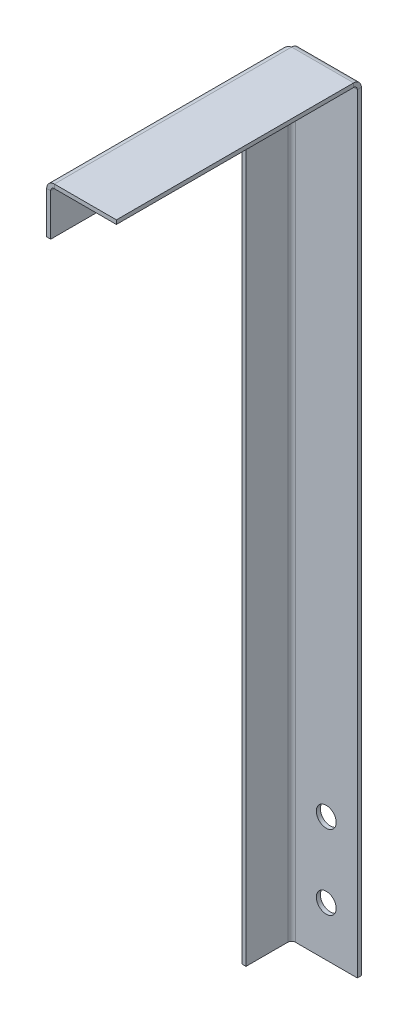
ISO-10303-21;
HEADER;
FILE_DESCRIPTION(('STEP AP214'),'2;1');
FILE_NAME('part.step','',(''),(''),'','','');
FILE_SCHEMA(('AUTOMOTIVE_DESIGN { 1 0 10303 214 1 1 1 1 }'));
ENDSEC;
DATA;
#1=APPLICATION_CONTEXT('core data for automotive mechanical design processes');
#2=APPLICATION_PROTOCOL_DEFINITION('international standard','automotive_design',2000,#1);
#3=PRODUCT_CONTEXT('',#1,'mechanical');
#4=PRODUCT('Part','Part','',(#3));
#5=PRODUCT_RELATED_PRODUCT_CATEGORY('part','',(#4));
#6=PRODUCT_DEFINITION_FORMATION('','',#4);
#7=PRODUCT_DEFINITION_CONTEXT('part definition',#1,'design');
#8=PRODUCT_DEFINITION('design','',#6,#7);
#9=PRODUCT_DEFINITION_SHAPE('','',#8);
#10=(LENGTH_UNIT() NAMED_UNIT(*) SI_UNIT(.MILLI.,.METRE.));
#11=(NAMED_UNIT(*) PLANE_ANGLE_UNIT() SI_UNIT($,.RADIAN.));
#12=(NAMED_UNIT(*) SI_UNIT($,.STERADIAN.) SOLID_ANGLE_UNIT());
#13=UNCERTAINTY_MEASURE_WITH_UNIT(LENGTH_MEASURE(1.E-05),#10,'distance_accuracy_value','');
#14=(GEOMETRIC_REPRESENTATION_CONTEXT(3) GLOBAL_UNCERTAINTY_ASSIGNED_CONTEXT((#13)) GLOBAL_UNIT_ASSIGNED_CONTEXT((#10,
#11,#12)) REPRESENTATION_CONTEXT('',''));
#15=CARTESIAN_POINT('',(0.,0.,0.));
#16=DIRECTION('',(0.,0.,1.));
#17=DIRECTION('',(1.,0.,0.));
#18=AXIS2_PLACEMENT_3D('',#15,#16,#17);
#19=CARTESIAN_POINT('',(12.5,0.,-0.81));
#20=DIRECTION('',(1.,0.,0.));
#21=DIRECTION('',(0.,0.,-1.));
#22=AXIS2_PLACEMENT_3D('',#19,#20,#21);
#23=PLANE('',#22);
#24=DIRECTION('',(0.,1.,0.));
#25=VECTOR('',#24,1.);
#26=CARTESIAN_POINT('',(12.5,0.,0.));
#27=LINE('',#26,#25);
#28=CARTESIAN_POINT('',(12.5,0.,0.));
#29=VERTEX_POINT('',#28);
#30=CARTESIAN_POINT('',(12.5,155.,0.));
#31=VERTEX_POINT('',#30);
#32=EDGE_CURVE('E140',#29,#31,#27,.T.);
#33=ORIENTED_EDGE('',*,*,#32,.F.);
#34=DIRECTION('',(0.,0.,1.));
#35=VECTOR('',#34,1.);
#36=CARTESIAN_POINT('',(12.5,0.,-0.81));
#37=LINE('',#36,#35);
#38=CARTESIAN_POINT('',(12.5,0.,-0.81));
#39=VERTEX_POINT('',#38);
#40=EDGE_CURVE('E505',#39,#29,#37,.T.);
#41=ORIENTED_EDGE('',*,*,#40,.F.);
#42=DIRECTION('',(0.,1.,0.));
#43=VECTOR('',#42,1.);
#44=CARTESIAN_POINT('',(12.5,0.,-0.81));
#45=LINE('',#44,#43);
#46=CARTESIAN_POINT('',(12.5,155.,-0.81));
#47=VERTEX_POINT('',#46);
#48=EDGE_CURVE('E115',#39,#47,#45,.T.);
#49=ORIENTED_EDGE('',*,*,#48,.T.);
#50=DIRECTION('',(0.,0.,1.));
#51=VECTOR('',#50,1.);
#52=CARTESIAN_POINT('',(12.5,155.,-0.81));
#53=LINE('',#52,#51);
#54=EDGE_CURVE('E106',#47,#31,#53,.T.);
#55=ORIENTED_EDGE('',*,*,#54,.T.);
#56=EDGE_LOOP('',(#33,#41,#49,#55));
#57=FACE_BOUND('',#56,.T.);
#58=ADVANCED_FACE('F96',(#57),#23,.T.);
#59=CARTESIAN_POINT('',(0.,0.,-0.81));
#60=DIRECTION('',(0.,-1.,0.));
#61=DIRECTION('',(0.,0.,-1.));
#62=AXIS2_PLACEMENT_3D('',#59,#60,#61);
#63=PLANE('',#62);
#64=DIRECTION('',(1.,0.,0.));
#65=VECTOR('',#64,1.);
#66=CARTESIAN_POINT('',(0.,0.,0.));
#67=LINE('',#66,#65);
#68=CARTESIAN_POINT('',(0.,0.,0.));
#69=VERTEX_POINT('',#68);
#70=EDGE_CURVE('E179',#69,#29,#67,.T.);
#71=ORIENTED_EDGE('',*,*,#70,.F.);
#72=DIRECTION('',(0.,0.,1.));
#73=VECTOR('',#72,1.);
#74=CARTESIAN_POINT('',(0.,0.,-0.81));
#75=LINE('',#74,#73);
#76=CARTESIAN_POINT('',(0.,0.,-0.810000000000006));
#77=VERTEX_POINT('',#76);
#78=EDGE_CURVE('E100',#77,#69,#75,.T.);
#79=ORIENTED_EDGE('',*,*,#78,.F.);
#80=DIRECTION('',(1.,0.,0.));
#81=VECTOR('',#80,1.);
#82=CARTESIAN_POINT('',(0.,0.,-0.81));
#83=LINE('',#82,#81);
#84=EDGE_CURVE('E496',#77,#39,#83,.T.);
#85=ORIENTED_EDGE('',*,*,#84,.T.);
#86=ORIENTED_EDGE('',*,*,#40,.T.);
#87=EDGE_LOOP('',(#71,#79,#85,#86));
#88=FACE_BOUND('',#87,.T.);
#89=ADVANCED_FACE('F98',(#88),#63,.T.);
#90=CARTESIAN_POINT('',(0.,0.,-0.81));
#91=DIRECTION('',(0.,0.,-1.));
#92=DIRECTION('',(-1.,0.,0.));
#93=AXIS2_PLACEMENT_3D('',#90,#91,#92);
#94=PLANE('',#93);
#95=CARTESIAN_POINT('',(6.25,10.,-0.81));
#96=DIRECTION('',(0.,0.,-1.));
#97=DIRECTION('',(-1.,0.,0.));
#98=AXIS2_PLACEMENT_3D('',#95,#96,#97);
#99=CIRCLE('',#98,2.);
#100=CARTESIAN_POINT('',(4.25,10.,-0.81));
#101=VERTEX_POINT('',#100);
#102=EDGE_CURVE('E562',#101,#101,#99,.F.);
#103=ORIENTED_EDGE('',*,*,#102,.T.);
#104=EDGE_LOOP('',(#103));
#105=FACE_BOUND('',#104,.T.);
#106=CARTESIAN_POINT('',(6.25,25.,-0.81));
#107=DIRECTION('',(0.,0.,-1.));
#108=DIRECTION('',(-1.,0.,0.));
#109=AXIS2_PLACEMENT_3D('',#106,#107,#108);
#110=CIRCLE('',#109,2.);
#111=CARTESIAN_POINT('',(4.25,25.,-0.81));
#112=VERTEX_POINT('',#111);
#113=EDGE_CURVE('E556',#112,#112,#110,.F.);
#114=ORIENTED_EDGE('',*,*,#113,.T.);
#115=EDGE_LOOP('',(#114));
#116=FACE_BOUND('',#115,.T.);
#117=DIRECTION('',(0.,-1.,0.));
#118=VECTOR('',#117,1.);
#119=CARTESIAN_POINT('',(0.,0.,-0.81));
#120=LINE('',#119,#118);
#121=CARTESIAN_POINT('',(0.,155.,-0.809999999999997));
#122=VERTEX_POINT('',#121);
#123=EDGE_CURVE('E145',#122,#77,#120,.T.);
#124=ORIENTED_EDGE('',*,*,#123,.F.);
#125=DIRECTION('',(-1.,0.,0.));
#126=VECTOR('',#125,1.);
#127=CARTESIAN_POINT('',(0.,155.,-0.81));
#128=LINE('',#127,#126);
#129=EDGE_CURVE('E500',#47,#122,#128,.T.);
#130=ORIENTED_EDGE('',*,*,#129,.F.);
#131=ORIENTED_EDGE('',*,*,#48,.F.);
#132=ORIENTED_EDGE('',*,*,#84,.F.);
#133=EDGE_LOOP('',(#124,#130,#131,#132));
#134=FACE_BOUND('',#133,.T.);
#135=ADVANCED_FACE('F252',(#105,#116,#134),#94,.T.);
#136=CARTESIAN_POINT('',(0.,0.,0.));
#137=DIRECTION('',(0.,0.,-1.));
#138=DIRECTION('',(-1.,0.,0.));
#139=AXIS2_PLACEMENT_3D('',#136,#137,#138);
#140=PLANE('',#139);
#141=CARTESIAN_POINT('',(6.25,10.,0.));
#142=DIRECTION('',(0.,0.,1.));
#143=DIRECTION('',(1.,0.,0.));
#144=AXIS2_PLACEMENT_3D('',#141,#142,#143);
#145=CIRCLE('',#144,2.);
#146=CARTESIAN_POINT('',(8.25,10.,0.));
#147=VERTEX_POINT('',#146);
#148=EDGE_CURVE('E560',#147,#147,#145,.T.);
#149=ORIENTED_EDGE('',*,*,#148,.F.);
#150=EDGE_LOOP('',(#149));
#151=FACE_BOUND('',#150,.T.);
#152=CARTESIAN_POINT('',(6.25,25.,0.));
#153=DIRECTION('',(0.,0.,1.));
#154=DIRECTION('',(1.,0.,0.));
#155=AXIS2_PLACEMENT_3D('',#152,#153,#154);
#156=CIRCLE('',#155,2.);
#157=CARTESIAN_POINT('',(8.25,25.,0.));
#158=VERTEX_POINT('',#157);
#159=EDGE_CURVE('E554',#158,#158,#156,.T.);
#160=ORIENTED_EDGE('',*,*,#159,.F.);
#161=EDGE_LOOP('',(#160));
#162=FACE_BOUND('',#161,.T.);
#163=DIRECTION('',(0.,-1.,0.));
#164=VECTOR('',#163,1.);
#165=CARTESIAN_POINT('',(0.,0.,0.));
#166=LINE('',#165,#164);
#167=CARTESIAN_POINT('',(0.,155.,0.));
#168=VERTEX_POINT('',#167);
#169=EDGE_CURVE('E138',#168,#69,#166,.T.);
#170=ORIENTED_EDGE('',*,*,#169,.T.);
#171=ORIENTED_EDGE('',*,*,#70,.T.);
#172=ORIENTED_EDGE('',*,*,#32,.T.);
#173=DIRECTION('',(-1.,0.,0.));
#174=VECTOR('',#173,1.);
#175=CARTESIAN_POINT('',(0.,155.,0.));
#176=LINE('',#175,#174);
#177=EDGE_CURVE('E134',#31,#168,#176,.T.);
#178=ORIENTED_EDGE('',*,*,#177,.T.);
#179=EDGE_LOOP('',(#170,#171,#172,#178));
#180=FACE_BOUND('',#179,.T.);
#181=ADVANCED_FACE('F135',(#151,#162,#180),#140,.F.);
#182=CARTESIAN_POINT('',(12.5,155.,0.736600000000006));
#183=DIRECTION('',(1.,0.,0.));
#184=DIRECTION('',(0.,0.,-1.));
#185=AXIS2_PLACEMENT_3D('',#182,#183,#184);
#186=PLANE('',#185);
#187=DIRECTION('',(0.,-1.,0.));
#188=VECTOR('',#187,1.);
#189=CARTESIAN_POINT('',(12.5,156.5466,0.736600000000001));
#190=LINE('',#189,#188);
#191=CARTESIAN_POINT('',(12.5,155.7366,0.736600000000004));
#192=VERTEX_POINT('',#191);
#193=CARTESIAN_POINT('',(12.5,156.5466,0.736600000000001));
#194=VERTEX_POINT('',#193);
#195=EDGE_CURVE('E467',#192,#194,#190,.F.);
#196=ORIENTED_EDGE('',*,*,#195,.F.);
#197=CARTESIAN_POINT('',(12.5,155.,0.736600000000006));
#198=DIRECTION('',(-1.,0.,0.));
#199=DIRECTION('',(0.,0.,1.));
#200=AXIS2_PLACEMENT_3D('',#197,#198,#199);
#201=CIRCLE('',#200,0.736600000000004);
#202=EDGE_CURVE('E166',#31,#192,#201,.F.);
#203=ORIENTED_EDGE('',*,*,#202,.F.);
#204=ORIENTED_EDGE('',*,*,#54,.F.);
#205=CARTESIAN_POINT('',(12.5,155.,0.736600000000006));
#206=DIRECTION('',(-1.,0.,0.));
#207=DIRECTION('',(0.,0.,1.));
#208=AXIS2_PLACEMENT_3D('',#205,#206,#207);
#209=CIRCLE('',#208,1.5466);
#210=EDGE_CURVE('E180',#47,#194,#209,.F.);
#211=ORIENTED_EDGE('',*,*,#210,.T.);
#212=EDGE_LOOP('',(#196,#203,#204,#211));
#213=FACE_BOUND('',#212,.T.);
#214=ADVANCED_FACE('F257',(#213),#186,.T.);
#215=CARTESIAN_POINT('',(0.,155.,0.736600000000006));
#216=DIRECTION('',(1.,0.,0.));
#217=DIRECTION('',(0.,0.,-1.));
#218=AXIS2_PLACEMENT_3D('',#215,#216,#217);
#219=PLANE('',#218);
#220=CARTESIAN_POINT('',(0.,155.,0.736600000000006));
#221=DIRECTION('',(-1.,0.,0.));
#222=DIRECTION('',(0.,0.,1.));
#223=AXIS2_PLACEMENT_3D('',#220,#221,#222);
#224=CIRCLE('',#223,0.736600000000004);
#225=CARTESIAN_POINT('',(0.,155.7366,0.736600000000005));
#226=VERTEX_POINT('',#225);
#227=EDGE_CURVE('E154',#226,#168,#224,.T.);
#228=ORIENTED_EDGE('',*,*,#227,.F.);
#229=DIRECTION('',(0.,-1.,0.));
#230=VECTOR('',#229,1.);
#231=CARTESIAN_POINT('',(0.,155.7366,0.736600000000004));
#232=LINE('',#231,#230);
#233=CARTESIAN_POINT('',(0.,156.5466,0.736600000000005));
#234=VERTEX_POINT('',#233);
#235=EDGE_CURVE('E479',#226,#234,#232,.F.);
#236=ORIENTED_EDGE('',*,*,#235,.T.);
#237=CARTESIAN_POINT('',(0.,155.,0.736600000000006));
#238=DIRECTION('',(-1.,0.,0.));
#239=DIRECTION('',(0.,0.,1.));
#240=AXIS2_PLACEMENT_3D('',#237,#238,#239);
#241=CIRCLE('',#240,1.5466);
#242=EDGE_CURVE('E157',#234,#122,#241,.T.);
#243=ORIENTED_EDGE('',*,*,#242,.T.);
#244=DIRECTION('',(0.,0.,1.));
#245=VECTOR('',#244,1.);
#246=CARTESIAN_POINT('',(0.,155.,-0.81));
#247=LINE('',#246,#245);
#248=EDGE_CURVE('E13',#122,#168,#247,.T.);
#249=ORIENTED_EDGE('',*,*,#248,.T.);
#250=EDGE_LOOP('',(#228,#236,#243,#249));
#251=FACE_BOUND('',#250,.T.);
#252=ADVANCED_FACE('F151',(#251),#219,.F.);
#253=CARTESIAN_POINT('',(0.,155.,0.736600000000006));
#254=DIRECTION('',(-1.,0.,0.));
#255=DIRECTION('',(0.,1.,0.));
#256=AXIS2_PLACEMENT_3D('',#253,#254,#255);
#257=CYLINDRICAL_SURFACE('',#256,1.5466);
#258=ORIENTED_EDGE('',*,*,#129,.T.);
#259=ORIENTED_EDGE('',*,*,#242,.F.);
#260=DIRECTION('',(-1.,0.,0.));
#261=VECTOR('',#260,1.);
#262=CARTESIAN_POINT('',(12.5,156.5466,0.736600000000001));
#263=LINE('',#262,#261);
#264=EDGE_CURVE('E484',#234,#194,#263,.F.);
#265=ORIENTED_EDGE('',*,*,#264,.T.);
#266=ORIENTED_EDGE('',*,*,#210,.F.);
#267=EDGE_LOOP('',(#258,#259,#265,#266));
#268=FACE_BOUND('',#267,.T.);
#269=ADVANCED_FACE('F264',(#268),#257,.T.);
#270=CARTESIAN_POINT('',(0.,155.,0.736600000000006));
#271=DIRECTION('',(-1.,0.,0.));
#272=DIRECTION('',(0.,1.,0.));
#273=AXIS2_PLACEMENT_3D('',#270,#271,#272);
#274=CYLINDRICAL_SURFACE('',#273,0.736600000000004);
#275=ORIENTED_EDGE('',*,*,#177,.F.);
#276=ORIENTED_EDGE('',*,*,#202,.T.);
#277=DIRECTION('',(-1.,0.,0.));
#278=VECTOR('',#277,1.);
#279=CARTESIAN_POINT('',(12.5,155.7366,0.736600000000004));
#280=LINE('',#279,#278);
#281=EDGE_CURVE('E165',#192,#226,#280,.T.);
#282=ORIENTED_EDGE('',*,*,#281,.T.);
#283=ORIENTED_EDGE('',*,*,#227,.T.);
#284=EDGE_LOOP('',(#275,#276,#282,#283));
#285=FACE_BOUND('',#284,.T.);
#286=ADVANCED_FACE('F163',(#285),#274,.F.);
#287=CARTESIAN_POINT('',(12.5,156.5466,0.));
#288=DIRECTION('',(-1.,0.,0.));
#289=DIRECTION('',(0.,0.,1.));
#290=AXIS2_PLACEMENT_3D('',#287,#288,#289);
#291=PLANE('',#290);
#292=ORIENTED_EDGE('',*,*,#195,.T.);
#293=DIRECTION('',(0.,0.,-1.));
#294=VECTOR('',#293,1.);
#295=CARTESIAN_POINT('',(12.5,156.5466,-5.34647084373176E-13));
#296=LINE('',#295,#294);
#297=CARTESIAN_POINT('',(12.5,156.5466,48.5366));
#298=VERTEX_POINT('',#297);
#299=EDGE_CURVE('E511',#298,#194,#296,.T.);
#300=ORIENTED_EDGE('',*,*,#299,.F.);
#301=DIRECTION('',(0.,-1.,0.));
#302=VECTOR('',#301,1.);
#303=CARTESIAN_POINT('',(12.5,156.5466,48.5366));
#304=LINE('',#303,#302);
#305=CARTESIAN_POINT('',(12.5,155.7366,48.5366));
#306=VERTEX_POINT('',#305);
#307=EDGE_CURVE('E483',#298,#306,#304,.T.);
#308=ORIENTED_EDGE('',*,*,#307,.T.);
#309=DIRECTION('',(0.,0.,1.));
#310=VECTOR('',#309,1.);
#311=CARTESIAN_POINT('',(12.5,155.7366,0.));
#312=LINE('',#311,#310);
#313=EDGE_CURVE('E477',#306,#192,#312,.F.);
#314=ORIENTED_EDGE('',*,*,#313,.T.);
#315=EDGE_LOOP('',(#292,#300,#308,#314));
#316=FACE_BOUND('',#315,.T.);
#317=ADVANCED_FACE('F270',(#316),#291,.F.);
#318=CARTESIAN_POINT('',(0.,156.5466,-5.34647084373176E-13));
#319=DIRECTION('',(0.,-1.,0.));
#320=DIRECTION('',(0.,0.,-1.));
#321=AXIS2_PLACEMENT_3D('',#318,#319,#320);
#322=PLANE('',#321);
#323=ORIENTED_EDGE('',*,*,#264,.F.);
#324=DIRECTION('',(0.,0.,1.));
#325=VECTOR('',#324,1.);
#326=CARTESIAN_POINT('',(0.,156.5466,-5.34647084373176E-13));
#327=LINE('',#326,#325);
#328=CARTESIAN_POINT('',(0.,156.5466,48.5366));
#329=VERTEX_POINT('',#328);
#330=EDGE_CURVE('E509',#234,#329,#327,.T.);
#331=ORIENTED_EDGE('',*,*,#330,.T.);
#332=DIRECTION('',(1.,0.,0.));
#333=VECTOR('',#332,1.);
#334=CARTESIAN_POINT('',(0.,156.5466,48.5366));
#335=LINE('',#334,#333);
#336=EDGE_CURVE('E512',#329,#298,#335,.T.);
#337=ORIENTED_EDGE('',*,*,#336,.T.);
#338=ORIENTED_EDGE('',*,*,#299,.T.);
#339=EDGE_LOOP('',(#323,#331,#337,#338));
#340=FACE_BOUND('',#339,.T.);
#341=ADVANCED_FACE('F276',(#340),#322,.F.);
#342=CARTESIAN_POINT('',(0.,155.7366,-5.31818984488713E-13));
#343=DIRECTION('',(0.,-1.,0.));
#344=DIRECTION('',(0.,0.,-1.));
#345=AXIS2_PLACEMENT_3D('',#342,#343,#344);
#346=PLANE('',#345);
#347=DIRECTION('',(0.,0.,-1.));
#348=VECTOR('',#347,1.);
#349=CARTESIAN_POINT('',(0.,155.7366,48.5366));
#350=LINE('',#349,#348);
#351=CARTESIAN_POINT('',(0.,155.7366,48.5366));
#352=VERTEX_POINT('',#351);
#353=EDGE_CURVE('E478',#226,#352,#350,.F.);
#354=ORIENTED_EDGE('',*,*,#353,.F.);
#355=ORIENTED_EDGE('',*,*,#281,.F.);
#356=ORIENTED_EDGE('',*,*,#313,.F.);
#357=DIRECTION('',(-1.,0.,0.));
#358=VECTOR('',#357,1.);
#359=CARTESIAN_POINT('',(12.5,155.7366,48.5366));
#360=LINE('',#359,#358);
#361=EDGE_CURVE('E486',#352,#306,#360,.F.);
#362=ORIENTED_EDGE('',*,*,#361,.F.);
#363=EDGE_LOOP('',(#354,#355,#356,#362));
#364=FACE_BOUND('',#363,.T.);
#365=ADVANCED_FACE('F282',(#364),#346,.T.);
#366=CARTESIAN_POINT('',(12.5,156.5466,48.5366));
#367=DIRECTION('',(0.,0.,-1.));
#368=DIRECTION('',(0.,1.,0.));
#369=AXIS2_PLACEMENT_3D('',#366,#367,#368);
#370=PLANE('',#369);
#371=ORIENTED_EDGE('',*,*,#361,.T.);
#372=ORIENTED_EDGE('',*,*,#307,.F.);
#373=ORIENTED_EDGE('',*,*,#336,.F.);
#374=DIRECTION('',(0.,-1.,0.));
#375=VECTOR('',#374,1.);
#376=CARTESIAN_POINT('',(0.,156.5466,48.5366));
#377=LINE('',#376,#375);
#378=EDGE_CURVE('E167',#329,#352,#377,.T.);
#379=ORIENTED_EDGE('',*,*,#378,.T.);
#380=EDGE_LOOP('',(#371,#372,#373,#379));
#381=FACE_BOUND('',#380,.T.);
#382=ADVANCED_FACE('F278',(#381),#370,.F.);
#383=CARTESIAN_POINT('',(0.,155.,48.5366));
#384=DIRECTION('',(0.,0.,1.));
#385=DIRECTION('',(1.,0.,0.));
#386=AXIS2_PLACEMENT_3D('',#383,#384,#385);
#387=PLANE('',#386);
#388=DIRECTION('',(1.,0.,0.));
#389=VECTOR('',#388,1.);
#390=CARTESIAN_POINT('',(-1.5466,155.,48.5366));
#391=LINE('',#390,#389);
#392=CARTESIAN_POINT('',(-0.7366,155.,48.5366));
#393=VERTEX_POINT('',#392);
#394=CARTESIAN_POINT('',(-1.5466,155.,48.5366));
#395=VERTEX_POINT('',#394);
#396=EDGE_CURVE('E523',#393,#395,#391,.F.);
#397=ORIENTED_EDGE('',*,*,#396,.F.);
#398=CARTESIAN_POINT('',(0.,155.,48.5366));
#399=DIRECTION('',(0.,0.,-1.));
#400=DIRECTION('',(-1.,0.,0.));
#401=AXIS2_PLACEMENT_3D('',#398,#399,#400);
#402=CIRCLE('',#401,0.736600000000002);
#403=EDGE_CURVE('E319',#352,#393,#402,.F.);
#404=ORIENTED_EDGE('',*,*,#403,.F.);
#405=ORIENTED_EDGE('',*,*,#378,.F.);
#406=CARTESIAN_POINT('',(0.,155.,48.5366));
#407=DIRECTION('',(0.,0.,-1.));
#408=DIRECTION('',(-1.,0.,0.));
#409=AXIS2_PLACEMENT_3D('',#406,#407,#408);
#410=CIRCLE('',#409,1.5466);
#411=EDGE_CURVE('E472',#329,#395,#410,.F.);
#412=ORIENTED_EDGE('',*,*,#411,.T.);
#413=EDGE_LOOP('',(#397,#404,#405,#412));
#414=FACE_BOUND('',#413,.T.);
#415=ADVANCED_FACE('F281',(#414),#387,.T.);
#416=CARTESIAN_POINT('',(-1.5547,155.,1.44370678118656));
#417=CARTESIAN_POINT('',(-1.55470000000003,155.203543614347,1.38477140113303));
#418=CARTESIAN_POINT('',(-1.51423532041627,155.406939435813,1.3258556509888));
#419=CARTESIAN_POINT('',(-1.35847569797443,155.782976428783,1.20800452079104));
#420=CARTESIAN_POINT('',(-1.24324203987652,155.955435785545,1.14907895569216));
#421=CARTESIAN_POINT('',(-0.95543578554506,156.243242039876,1.0312278254944));
#422=CARTESIAN_POINT('',(-0.782976428782685,156.358475697974,0.972302260395522));
#423=CARTESIAN_POINT('',(-0.406939435813399,156.514235320416,0.854451130197764));
#424=CARTESIAN_POINT('',(-0.203543614347026,156.5547,0.795535380053542));
#425=CARTESIAN_POINT('',(0.,156.5547,0.736600000000005));
#426=CARTESIAN_POINT('',(-1.5466,155.,1.44370678118656));
#427=CARTESIAN_POINT('',(-1.54660000000003,155.202483116895,1.38477142172481));
#428=CARTESIAN_POINT('',(-1.50634614173526,155.40481927795,1.3258556509888));
#429=CARTESIAN_POINT('',(-1.35139802822876,155.778897115042,1.20800452079104));
#430=CARTESIAN_POINT('',(-1.23676473845309,155.950457957113,1.14907895569216));
#431=CARTESIAN_POINT('',(-0.950457957113263,156.236764738453,1.0312278254944));
#432=CARTESIAN_POINT('',(-0.778897115041681,156.351398028229,0.972302260395522));
#433=CARTESIAN_POINT('',(-0.404819277950089,156.506346141735,0.854451130197764));
#434=CARTESIAN_POINT('',(-0.202483116895243,156.5466,0.795535359461768));
#435=CARTESIAN_POINT('',(0.,156.5466,0.736600000000005));
#436=CARTESIAN_POINT('',(-0.736600000000003,155.,1.44370678118656));
#437=CARTESIAN_POINT('',(-0.736600000000014,155.096433371717,1.38477348090225));
#438=CARTESIAN_POINT('',(-0.717428273633904,155.192803491619,1.3258556509888));
#439=CARTESIAN_POINT('',(-0.643631053661778,155.370965740941,1.20800452079104));
#440=CARTESIAN_POINT('',(-0.589034596110533,155.452675113934,1.14907895569216));
#441=CARTESIAN_POINT('',(-0.452675113933553,155.589034596111,1.0312278254944));
#442=CARTESIAN_POINT('',(-0.370965740941231,155.643631053662,0.972302260395522));
#443=CARTESIAN_POINT('',(-0.19280349161906,155.717428273634,0.854451130197764));
#444=CARTESIAN_POINT('',(-0.0964333717169542,155.7366,0.795533300284292));
#445=CARTESIAN_POINT('',(0.,155.7366,0.736600000000005));
#446=CARTESIAN_POINT('',(-0.728419000000003,155.,1.44370678118656));
#447=CARTESIAN_POINT('',(-0.728419000000014,155.095362269291,1.38477350169994));
#448=CARTESIAN_POINT('',(-0.70946020316608,155.190662132177,1.3258556509888));
#449=CARTESIAN_POINT('',(-0.636482607218652,155.366845634063,1.20800452079104));
#450=CARTESIAN_POINT('',(-0.582492521672873,155.447647507217,1.14907895569216));
#451=CARTESIAN_POINT('',(-0.447647507217438,155.582492521673,1.0312278254944));
#452=CARTESIAN_POINT('',(-0.366845634062816,155.636482607219,0.972302260395522));
#453=CARTESIAN_POINT('',(-0.190662132177117,155.709460203166,0.854451130197764));
#454=CARTESIAN_POINT('',(-0.0953622692906535,155.728419,0.795533279486599));
#455=CARTESIAN_POINT('',(0.,155.728419,0.736600000000005));
#456=B_SPLINE_SURFACE_WITH_KNOTS('',1,3,((#416,#417,#418,#419,#420,#421,#422,#423,#424,#425),
(#426,#427,#428,#429,#430,#431,#432,#433,#434,#435),(#436,#437,#438,#439,#440,#441,#442,#443,
#444,#445),(#446,#447,#448,#449,#450,#451,#452,#453,#454,#455)),.UNSPECIFIED.,.F.,.F.,.F.,(2,1,
1,2),(4,2,2,2,4),(-0.01,0.,1.,1.0101),(0.,0.25,0.5,0.75,1.),.UNSPECIFIED.);
#457=CARTESIAN_POINT('',(-0.736600000000003,155.,1.44370678118656));
#458=CARTESIAN_POINT('',(-0.736600650815132,155.02683709898,1.42730387734434));
#459=CARTESIAN_POINT('',(-0.735131906011697,155.053658407147,1.41091256013043));
#460=CARTESIAN_POINT('',(-0.729283632859912,155.106982090652,1.37813068605329));
#461=CARTESIAN_POINT('',(-0.724904112139275,155.133484466824,1.36174012918818));
#462=CARTESIAN_POINT('',(-0.707475007773645,155.211931055611,1.31263058704175));
#463=CARTESIAN_POINT('',(-0.690134514092446,155.262973049785,1.27987924509061));
#464=CARTESIAN_POINT('',(-0.646924095972169,155.355586017775,1.21742214405926));
#465=CARTESIAN_POINT('',(-0.621983707101651,155.39759629148,1.18771290560021));
#466=CARTESIAN_POINT('',(-0.564339918878841,155.475876375384,1.12830251911178));
#467=CARTESIAN_POINT('',(-0.531641403416091,155.512149773211,1.09860137771426));
#468=CARTESIAN_POINT('',(-0.459756033776209,155.577551727805,1.03920791503063));
#469=CARTESIAN_POINT('',(-0.420569908991761,155.606681086854,1.00951559312849));
#470=CARTESIAN_POINT('',(-0.337216250616945,155.656678868693,0.950114378058107));
#471=CARTESIAN_POINT('',(-0.293047099221366,155.677544598613,0.920405482642109));
#472=CARTESIAN_POINT('',(-0.207663411402385,155.707969999017,0.865009732940531));
#473=CARTESIAN_POINT('',(-0.166853496100309,155.718674766999,0.839320684350566));
#474=CARTESIAN_POINT('',(-0.0840347371591856,155.733004715695,0.787956735105949));
#475=CARTESIAN_POINT('',(-0.0420265862914266,155.736633906293,0.762281834686468));
#476=CARTESIAN_POINT('',(0.,155.7366,0.736600000000005));
#477=B_SPLINE_CURVE_WITH_KNOTS('',3,(#457,#458,#459,#460,#461,#462,#463,#464,#465,#466,#467,
#468,#469,#470,#471,#472,#473,#474,#475,#476),.UNSPECIFIED.,.F.,.F.,(4,2,2,2,2,2,2,2,2,4),(0.,
0.0942858505156115,0.188571453955301,0.376598060041108,0.547357381731374,0.718009491041878,
0.8886424271914,1.05933092186686,1.2070048166953,1.35459499714926),.UNSPECIFIED.);
#478=CARTESIAN_POINT('',(-0.736600000000003,155.,1.44370678118656));
#479=VERTEX_POINT('',#478);
#480=EDGE_CURVE('E313',#479,#226,#477,.T.);
#481=DIRECTION('',(-1.,0.,0.));
#482=VECTOR('',#481,1.);
#483=CARTESIAN_POINT('',(-0.7366,155.,1.44370678118656));
#484=LINE('',#483,#482);
#485=CARTESIAN_POINT('',(-1.5466,155.,1.44370678118656));
#486=VERTEX_POINT('',#485);
#487=EDGE_CURVE('E320',#486,#479,#484,.F.);
#488=CARTESIAN_POINT('',(-1.5466,155.,1.44370678118656));
#489=CARTESIAN_POINT('',(-1.54660001518247,155.045325633854,1.43051315392023));
#490=CARTESIAN_POINT('',(-1.54460619523529,155.090629729696,1.4173265263798));
#491=CARTESIAN_POINT('',(-1.53665413907272,155.180886369307,1.39095452784367));
#492=CARTESIAN_POINT('',(-1.53069610991545,155.225838931312,1.37776915681832));
#493=CARTESIAN_POINT('',(-1.50693686998447,155.359564069098,1.33823800584838));
#494=CARTESIAN_POINT('',(-1.48325032932352,155.447358192905,1.31187301956955));
#495=CARTESIAN_POINT('',(-1.42089069240408,155.617466292517,1.25913743772194));
#496=CARTESIAN_POINT('',(-1.38220776896099,155.699776633246,1.23276684983128));
#497=CARTESIAN_POINT('',(-1.291053056864,155.856360507244,1.18003130769415));
#498=CARTESIAN_POINT('',(-1.23858446923998,155.930635900582,1.15366635356));
#499=CARTESIAN_POINT('',(-1.12147686554034,156.068863220653,1.10093521481356));
#500=CARTESIAN_POINT('',(-1.05683850517409,156.13281570324,1.07456903034405));
#501=CARTESIAN_POINT('',(-0.917349509950495,156.248458728673,1.02183039950967));
#502=CARTESIAN_POINT('',(-0.842495400187767,156.300145082716,0.995457954075425));
#503=CARTESIAN_POINT('',(-0.684887676067448,156.389648066131,0.942703607805266));
#504=CARTESIAN_POINT('',(-0.602131149243525,156.42745955681,0.916321707081107));
#505=CARTESIAN_POINT('',(-0.431321914570935,156.487992559248,0.863574536452941));
#506=CARTESIAN_POINT('',(-0.343275035883754,156.510730359053,0.837209279453678));
#507=CARTESIAN_POINT('',(-0.212011589838877,156.532593682912,0.798477792974017));
#508=CARTESIAN_POINT('',(-0.169741537098491,156.537846919397,0.786090663240772));
#509=CARTESIAN_POINT('',(-0.0849873234932795,156.544846620693,0.761337814365416));
#510=CARTESIAN_POINT('',(-0.042503672649507,156.546599262809,0.748972096049318));
#511=CARTESIAN_POINT('',(0.,156.5466,0.736600000000005));
#512=B_SPLINE_CURVE_WITH_KNOTS('',3,(#488,#489,#490,#491,#492,#493,#494,#495,#496,#497,#498,
#499,#500,#501,#502,#503,#504,#505,#506,#507,#508,#509,#510,#511),.UNSPECIFIED.,.F.,.F.,(4,2,2,
2,2,2,2,2,2,2,2,4),(0.,0.141533472521888,0.283059553063728,0.565636935266527,0.848399805327377,
1.13109707581384,1.41377911888177,1.69655755752738,1.97944062048793,2.2620175105342,
2.39497904894072,2.52770574941885),.UNSPECIFIED.);
#513=EDGE_CURVE('E306',#486,#234,#512,.T.);
#514=ORIENTED_EDGE('',*,*,#480,.F.);
#515=ORIENTED_EDGE('',*,*,#487,.F.);
#516=ORIENTED_EDGE('',*,*,#513,.T.);
#517=ORIENTED_EDGE('',*,*,#235,.F.);
#518=EDGE_LOOP('',(#514,#515,#516,#517));
#519=FACE_BOUND('',#518,.T.);
#520=ADVANCED_FACE('F290',(#519),#456,.F.);
#521=CARTESIAN_POINT('',(0.,155.,0.736600000000004));
#522=DIRECTION('',(0.,0.,-1.));
#523=DIRECTION('',(-1.,0.,0.));
#524=AXIS2_PLACEMENT_3D('',#521,#522,#523);
#525=CYLINDRICAL_SURFACE('',#524,1.5466);
#526=ORIENTED_EDGE('',*,*,#330,.F.);
#527=ORIENTED_EDGE('',*,*,#513,.F.);
#528=DIRECTION('',(0.,0.,-1.));
#529=VECTOR('',#528,1.);
#530=CARTESIAN_POINT('',(-1.5466,155.,48.5366));
#531=LINE('',#530,#529);
#532=EDGE_CURVE('E532',#486,#395,#531,.F.);
#533=ORIENTED_EDGE('',*,*,#532,.T.);
#534=ORIENTED_EDGE('',*,*,#411,.F.);
#535=EDGE_LOOP('',(#526,#527,#533,#534));
#536=FACE_BOUND('',#535,.T.);
#537=ADVANCED_FACE('F296',(#536),#525,.T.);
#538=CARTESIAN_POINT('',(0.,155.,0.736600000000004));
#539=DIRECTION('',(0.,0.,-1.));
#540=DIRECTION('',(-1.,0.,0.));
#541=AXIS2_PLACEMENT_3D('',#538,#539,#540);
#542=CYLINDRICAL_SURFACE('',#541,0.736600000000002);
#543=ORIENTED_EDGE('',*,*,#353,.T.);
#544=ORIENTED_EDGE('',*,*,#403,.T.);
#545=DIRECTION('',(0.,0.,-1.));
#546=VECTOR('',#545,1.);
#547=CARTESIAN_POINT('',(-0.7366,155.,48.5366));
#548=LINE('',#547,#546);
#549=EDGE_CURVE('E529',#393,#479,#548,.T.);
#550=ORIENTED_EDGE('',*,*,#549,.T.);
#551=ORIENTED_EDGE('',*,*,#480,.T.);
#552=EDGE_LOOP('',(#543,#544,#550,#551));
#553=FACE_BOUND('',#552,.T.);
#554=ADVANCED_FACE('F322',(#553),#542,.F.);
#555=CARTESIAN_POINT('',(-1.54660000000054,0.,0.));
#556=DIRECTION('',(1.,0.,0.));
#557=DIRECTION('',(0.,1.,0.));
#558=AXIS2_PLACEMENT_3D('',#555,#556,#557);
#559=PLANE('',#558);
#560=DIRECTION('',(0.,0.707106781186544,-0.707106781186551));
#561=VECTOR('',#560,1.);
#562=CARTESIAN_POINT('',(-1.54660000000012,121.1632103822,35.2804963989872));
#563=LINE('',#562,#561);
#564=CARTESIAN_POINT('',(-1.54660000000003,146.5466,9.89710678118662));
#565=VERTEX_POINT('',#564);
#566=EDGE_CURVE('E203',#565,#486,#563,.T.);
#567=ORIENTED_EDGE('',*,*,#566,.F.);
#568=DIRECTION('',(0.,0.,1.));
#569=VECTOR('',#568,1.);
#570=CARTESIAN_POINT('',(-1.54660000000003,146.5466,-5.10563000524685E-13));
#571=LINE('',#570,#569);
#572=CARTESIAN_POINT('',(-1.54660000000003,146.5466,48.5366));
#573=VERTEX_POINT('',#572);
#574=EDGE_CURVE('E539',#565,#573,#571,.T.);
#575=ORIENTED_EDGE('',*,*,#574,.T.);
#576=DIRECTION('',(0.,1.,0.));
#577=VECTOR('',#576,1.);
#578=CARTESIAN_POINT('',(-1.54660000000054,1.86065487183914E-13,48.5366000000006));
#579=LINE('',#578,#577);
#580=EDGE_CURVE('E541',#573,#395,#579,.T.);
#581=ORIENTED_EDGE('',*,*,#580,.T.);
#582=ORIENTED_EDGE('',*,*,#532,.F.);
#583=EDGE_LOOP('',(#567,#575,#581,#582));
#584=FACE_BOUND('',#583,.T.);
#585=ADVANCED_FACE('F325',(#584),#559,.F.);
#586=CARTESIAN_POINT('',(-0.736600000000541,0.,0.));
#587=DIRECTION('',(1.,0.,0.));
#588=DIRECTION('',(0.,1.,0.));
#589=AXIS2_PLACEMENT_3D('',#586,#587,#588);
#590=PLANE('',#589);
#591=DIRECTION('',(0.,0.,-1.));
#592=VECTOR('',#591,1.);
#593=CARTESIAN_POINT('',(-0.736600000000029,146.5466,48.5366));
#594=LINE('',#593,#592);
#595=CARTESIAN_POINT('',(-0.736600000000029,146.5466,9.89710678118662));
#596=VERTEX_POINT('',#595);
#597=CARTESIAN_POINT('',(-0.736600000000029,146.5466,48.5366));
#598=VERTEX_POINT('',#597);
#599=EDGE_CURVE('E534',#596,#598,#594,.F.);
#600=ORIENTED_EDGE('',*,*,#599,.F.);
#601=DIRECTION('',(0.,0.707106781186544,-0.707106781186551));
#602=VECTOR('',#601,1.);
#603=CARTESIAN_POINT('',(-0.736600000000268,78.2218533905941,78.2218533905933));
#604=LINE('',#603,#602);
#605=EDGE_CURVE('E530',#596,#479,#604,.T.);
#606=ORIENTED_EDGE('',*,*,#605,.T.);
#607=ORIENTED_EDGE('',*,*,#549,.F.);
#608=DIRECTION('',(0.,-1.,0.));
#609=VECTOR('',#608,1.);
#610=CARTESIAN_POINT('',(-0.736599999999997,155.7366,48.5366));
#611=LINE('',#610,#609);
#612=EDGE_CURVE('E536',#598,#393,#611,.F.);
#613=ORIENTED_EDGE('',*,*,#612,.F.);
#614=EDGE_LOOP('',(#600,#606,#607,#613));
#615=FACE_BOUND('',#614,.T.);
#616=ADVANCED_FACE('F335',(#615),#590,.T.);
#617=CARTESIAN_POINT('',(-1.54660000000003,146.5466,48.5366));
#618=DIRECTION('',(0.,1.,0.));
#619=DIRECTION('',(-1.,0.,0.));
#620=AXIS2_PLACEMENT_3D('',#617,#618,#619);
#621=PLANE('',#620);
#622=DIRECTION('',(-1.,0.,0.));
#623=VECTOR('',#622,1.);
#624=CARTESIAN_POINT('',(-1.54660000000003,146.5466,9.89710678118662));
#625=LINE('',#624,#623);
#626=EDGE_CURVE('E550',#596,#565,#625,.T.);
#627=ORIENTED_EDGE('',*,*,#626,.F.);
#628=ORIENTED_EDGE('',*,*,#599,.T.);
#629=DIRECTION('',(1.,0.,0.));
#630=VECTOR('',#629,1.);
#631=CARTESIAN_POINT('',(-1.54660000000003,146.5466,48.5366));
#632=LINE('',#631,#630);
#633=EDGE_CURVE('E544',#573,#598,#632,.T.);
#634=ORIENTED_EDGE('',*,*,#633,.F.);
#635=ORIENTED_EDGE('',*,*,#574,.F.);
#636=EDGE_LOOP('',(#627,#628,#634,#635));
#637=FACE_BOUND('',#636,.T.);
#638=ADVANCED_FACE('F331',(#637),#621,.F.);
#639=CARTESIAN_POINT('',(-1.5466,155.7366,48.5366));
#640=DIRECTION('',(0.,0.,-1.));
#641=DIRECTION('',(0.,1.,0.));
#642=AXIS2_PLACEMENT_3D('',#639,#640,#641);
#643=PLANE('',#642);
#644=ORIENTED_EDGE('',*,*,#396,.T.);
#645=ORIENTED_EDGE('',*,*,#580,.F.);
#646=ORIENTED_EDGE('',*,*,#633,.T.);
#647=ORIENTED_EDGE('',*,*,#612,.T.);
#648=EDGE_LOOP('',(#644,#645,#646,#647));
#649=FACE_BOUND('',#648,.T.);
#650=ADVANCED_FACE('F334',(#649),#643,.F.);
#651=CARTESIAN_POINT('',(-1.54660000000012,121.1632103822,35.2804963989872));
#652=DIRECTION('',(0.,-0.707106781186551,-0.707106781186544));
#653=DIRECTION('',(0.,0.707106781186544,-0.707106781186551));
#654=AXIS2_PLACEMENT_3D('',#651,#652,#653);
#655=PLANE('',#654);
#656=ORIENTED_EDGE('',*,*,#605,.F.);
#657=ORIENTED_EDGE('',*,*,#626,.T.);
#658=ORIENTED_EDGE('',*,*,#566,.T.);
#659=ORIENTED_EDGE('',*,*,#487,.T.);
#660=EDGE_LOOP('',(#656,#657,#658,#659));
#661=FACE_BOUND('',#660,.T.);
#662=ADVANCED_FACE('F339',(#661),#655,.T.);
#663=CARTESIAN_POINT('',(0.,155.,-0.818100000000006));
#664=CARTESIAN_POINT('',(-0.203543614346979,154.941064619946,-0.818100000000004));
#665=CARTESIAN_POINT('',(-0.406939435813378,154.882148869802,-0.777635320416233));
#666=CARTESIAN_POINT('',(-0.78297642878264,154.764297739604,-0.621875697974366));
#667=CARTESIAN_POINT('',(-0.955435785545002,154.705372174506,-0.506642039876452));
#668=CARTESIAN_POINT('',(-1.24324203987645,154.587521044308,-0.218835785545002));
#669=CARTESIAN_POINT('',(-1.35847569797436,154.528595479209,-0.0463764287826398));
#670=CARTESIAN_POINT('',(-1.51423532041623,154.410744349011,0.329660564186623));
#671=CARTESIAN_POINT('',(-1.5547,154.351828598867,0.533056385652977));
#672=CARTESIAN_POINT('',(-1.5547,154.292893218813,0.736599999999995));
#673=CARTESIAN_POINT('',(0.,155.,-0.810000000000006));
#674=CARTESIAN_POINT('',(-0.202483116895197,154.941064640538,-0.810000000000004));
#675=CARTESIAN_POINT('',(-0.404819277950067,154.882148869802,-0.76974614173522));
#676=CARTESIAN_POINT('',(-0.778897115041636,154.764297739604,-0.614798028228697));
#677=CARTESIAN_POINT('',(-0.950457957113205,154.705372174506,-0.500164738453027));
#678=CARTESIAN_POINT('',(-1.23676473845303,154.587521044308,-0.213857957113205));
#679=CARTESIAN_POINT('',(-1.35139802822869,154.528595479209,-0.0422971150416355));
#680=CARTESIAN_POINT('',(-1.50634614173522,154.410744349011,0.331780722049934));
#681=CARTESIAN_POINT('',(-1.5466,154.351828578275,0.53411688310476));
#682=CARTESIAN_POINT('',(-1.5466,154.292893218813,0.736599999999995));
#683=CARTESIAN_POINT('',(0.,155.,0.));
#684=CARTESIAN_POINT('',(-0.0964333717169591,154.941066699716,0.));
#685=CARTESIAN_POINT('',(-0.192803491619046,154.882148869802,0.0191717263661145));
#686=CARTESIAN_POINT('',(-0.370965740941204,154.764297739604,0.0929689463382503));
#687=CARTESIAN_POINT('',(-0.452675113933522,154.705372174506,0.147565403889497));
#688=CARTESIAN_POINT('',(-0.589034596110499,154.587521044308,0.283924886066475));
#689=CARTESIAN_POINT('',(-0.643631053661746,154.528595479209,0.365634259058793));
#690=CARTESIAN_POINT('',(-0.717428273633881,154.410744349011,0.543796508380952));
#691=CARTESIAN_POINT('',(-0.7366,154.351826519098,0.640166628283038));
#692=CARTESIAN_POINT('',(-0.7366,154.292893218813,0.736599999999997));
#693=CARTESIAN_POINT('',(0.,155.,0.00818099999999436));
#694=CARTESIAN_POINT('',(-0.0953622692906589,154.941066720513,0.00818099999999509));
#695=CARTESIAN_POINT('',(-0.190662132177103,154.882148869802,0.027139796833938));
#696=CARTESIAN_POINT('',(-0.36684563406279,154.764297739604,0.100117392781376));
#697=CARTESIAN_POINT('',(-0.447647507217407,154.705372174506,0.154107478327157));
#698=CARTESIAN_POINT('',(-0.582492521672839,154.587521044308,0.28895249278259));
#699=CARTESIAN_POINT('',(-0.636482607218619,154.528595479209,0.369754365937207));
#700=CARTESIAN_POINT('',(-0.709460203166057,154.410744349011,0.545937867822895));
#701=CARTESIAN_POINT('',(-0.728419,154.3518264983,0.641237730709339));
#702=CARTESIAN_POINT('',(-0.728419,154.292893218813,0.736599999999997));
#703=B_SPLINE_SURFACE_WITH_KNOTS('',1,3,((#663,#664,#665,#666,#667,#668,#669,#670,#671,#672),
(#673,#674,#675,#676,#677,#678,#679,#680,#681,#682),(#683,#684,#685,#686,#687,#688,#689,#690,
#691,#692),(#693,#694,#695,#696,#697,#698,#699,#700,#701,#702)),.UNSPECIFIED.,.F.,.F.,.F.,(2,1,
1,2),(4,2,2,2,4),(-0.01,0.,1.,1.0101),(0.,0.25,0.5,0.75,1.),.UNSPECIFIED.);
#704=DIRECTION('',(1.,0.,0.));
#705=VECTOR('',#704,1.);
#706=CARTESIAN_POINT('',(-0.7366,154.292893218813,0.736599999999997));
#707=LINE('',#706,#705);
#708=CARTESIAN_POINT('',(-1.5466,154.292893218813,0.736599999999995));
#709=VERTEX_POINT('',#708);
#710=CARTESIAN_POINT('',(-0.7366,154.292893218813,0.736599999999997));
#711=VERTEX_POINT('',#710);
#712=EDGE_CURVE('E185',#709,#711,#707,.T.);
#713=CARTESIAN_POINT('',(0.,155.,0.));
#714=CARTESIAN_POINT('',(-0.0268370989802788,154.983597096158,-6.50815130533243E-07));
#715=CARTESIAN_POINT('',(-0.0536584071473606,154.967205778944,0.00146809398830754));
#716=CARTESIAN_POINT('',(-0.106982090651545,154.934423904867,0.00731636714009691));
#717=CARTESIAN_POINT('',(-0.133484466824227,154.918033348002,0.0116958878607341));
#718=CARTESIAN_POINT('',(-0.211931055610941,154.868923805855,0.0291249922263718));
#719=CARTESIAN_POINT('',(-0.262973049785376,154.836172463904,0.0464654859075808));
#720=CARTESIAN_POINT('',(-0.355586017774943,154.773715362873,0.089675904027877));
#721=CARTESIAN_POINT('',(-0.39759629148032,154.744006124414,0.114616292898406));
#722=CARTESIAN_POINT('',(-0.475876375384296,154.684595737925,0.172260081121222));
#723=CARTESIAN_POINT('',(-0.512149773210601,154.654894596528,0.204958596583967));
#724=CARTESIAN_POINT('',(-0.577551727804723,154.595501133844,0.276843966223847));
#725=CARTESIAN_POINT('',(-0.606681086854152,154.565808811942,0.316030091008298));
#726=CARTESIAN_POINT('',(-0.656678868693253,154.506407596871,0.399383749383123));
#727=CARTESIAN_POINT('',(-0.677544598612475,154.476698701455,0.443552900778708));
#728=CARTESIAN_POINT('',(-0.707969999017304,154.421302951754,0.528936588597682));
#729=CARTESIAN_POINT('',(-0.718674766999145,154.395613903164,0.569746503899746));
#730=CARTESIAN_POINT('',(-0.733004715694662,154.344249953919,0.652565262840841));
#731=CARTESIAN_POINT('',(-0.736633906292474,154.3185750535,0.694573413708583));
#732=CARTESIAN_POINT('',(-0.7366,154.292893218813,0.736599999999997));
#733=B_SPLINE_CURVE_WITH_KNOTS('',3,(#713,#714,#715,#716,#717,#718,#719,#720,#721,#722,#723,
#724,#725,#726,#727,#728,#729,#730,#731,#732),.UNSPECIFIED.,.F.,.F.,(4,2,2,2,2,2,2,2,2,4),(0.,
0.0942858505156046,0.188571453955277,0.376598060041105,0.547357381731401,0.71800949104192,
0.888642427191432,1.05933092186688,1.20700481669527,1.35459499714919),.UNSPECIFIED.);
#734=EDGE_CURVE('E175',#168,#711,#733,.T.);
#735=CARTESIAN_POINT('',(0.,155.,-0.810000000000006));
#736=CARTESIAN_POINT('',(-0.0453256338536851,154.986806372734,-0.810000015182461));
#737=CARTESIAN_POINT('',(-0.0906297296964364,154.973619745193,-0.808006195235277));
#738=CARTESIAN_POINT('',(-0.180886369307038,154.947247746657,-0.800054139072697));
#739=CARTESIAN_POINT('',(-0.225838931312098,154.934062375632,-0.794096109915429));
#740=CARTESIAN_POINT('',(-0.359564069098027,154.894531224662,-0.77033686998443));
#741=CARTESIAN_POINT('',(-0.447358192905265,154.868166238383,-0.746650329323468));
#742=CARTESIAN_POINT('',(-0.617466292517522,154.815430656535,-0.684290692404006));
#743=CARTESIAN_POINT('',(-0.69977663324585,154.789060068645,-0.645607768960904));
#744=CARTESIAN_POINT('',(-0.856360507243822,154.736324526508,-0.554453056863889));
#745=CARTESIAN_POINT('',(-0.930635900582599,154.709959572373,-0.501984469239858));
#746=CARTESIAN_POINT('',(-1.068863220653,154.657228433627,-0.384876865540206));
#747=CARTESIAN_POINT('',(-1.1328157032401,154.630862249157,-0.32023850517394));
#748=CARTESIAN_POINT('',(-1.24845872867253,154.578123618323,-0.180749509950337));
#749=CARTESIAN_POINT('',(-1.30014508271638,154.551751172889,-0.105895400187606));
#750=CARTESIAN_POINT('',(-1.38964806613116,154.498996826619,0.0517123239327148));
#751=CARTESIAN_POINT('',(-1.42745955681043,154.472614925895,0.134468850756639));
#752=CARTESIAN_POINT('',(-1.48799255924768,154.419867755266,0.305278085429234));
#753=CARTESIAN_POINT('',(-1.51073035905341,154.393502498267,0.393324964116418));
#754=CARTESIAN_POINT('',(-1.53259368291241,154.354771011787,0.524588410161271));
#755=CARTESIAN_POINT('',(-1.53784691939706,154.342383882054,0.566858462901628));
#756=CARTESIAN_POINT('',(-1.54484662069249,154.317631033179,0.65161267650678));
#757=CARTESIAN_POINT('',(-1.54659926280915,154.305265314863,0.694096327350522));
#758=CARTESIAN_POINT('',(-1.5466,154.292893218813,0.736599999999995));
#759=B_SPLINE_CURVE_WITH_KNOTS('',3,(#735,#736,#737,#738,#739,#740,#741,#742,#743,#744,#745,
#746,#747,#748,#749,#750,#751,#752,#753,#754,#755,#756,#757,#758),.UNSPECIFIED.,.F.,.F.,(4,2,2,
2,2,2,2,2,2,2,2,4),(0.,0.141533472521876,0.283059553063695,0.56563693526647,0.848399805327391,
1.1310970758139,1.4137791188818,1.69655755752737,1.97944062048794,2.26201751053421,
2.39497904894063,2.52770574941867),.UNSPECIFIED.);
#760=EDGE_CURVE('E189',#122,#709,#759,.T.);
#761=ORIENTED_EDGE('',*,*,#712,.T.);
#762=ORIENTED_EDGE('',*,*,#734,.F.);
#763=ORIENTED_EDGE('',*,*,#248,.F.);
#764=ORIENTED_EDGE('',*,*,#760,.T.);
#765=EDGE_LOOP('',(#761,#762,#763,#764));
#766=FACE_BOUND('',#765,.T.);
#767=ADVANCED_FACE('F183',(#766),#703,.F.);
#768=CARTESIAN_POINT('',(0.,0.,0.7366));
#769=DIRECTION('',(0.,1.,0.));
#770=DIRECTION('',(-1.,0.,0.));
#771=AXIS2_PLACEMENT_3D('',#768,#769,#770);
#772=PLANE('',#771);
#773=CARTESIAN_POINT('',(0.,0.,0.7366));
#774=DIRECTION('',(0.,-1.,0.));
#775=DIRECTION('',(1.,0.,0.));
#776=AXIS2_PLACEMENT_3D('',#773,#774,#775);
#777=CIRCLE('',#776,0.736600000000006);
#778=CARTESIAN_POINT('',(-0.736600000000011,0.,0.736599999999997));
#779=VERTEX_POINT('',#778);
#780=EDGE_CURVE('E178',#779,#69,#777,.T.);
#781=ORIENTED_EDGE('',*,*,#780,.F.);
#782=DIRECTION('',(1.,0.,0.));
#783=VECTOR('',#782,1.);
#784=CARTESIAN_POINT('',(-0.7366,0.,0.736599999999997));
#785=LINE('',#784,#783);
#786=CARTESIAN_POINT('',(-1.5466,0.,0.736599999999995));
#787=VERTEX_POINT('',#786);
#788=EDGE_CURVE('E358',#779,#787,#785,.F.);
#789=ORIENTED_EDGE('',*,*,#788,.T.);
#790=CARTESIAN_POINT('',(0.,0.,0.7366));
#791=DIRECTION('',(0.,-1.,0.));
#792=DIRECTION('',(1.,0.,0.));
#793=AXIS2_PLACEMENT_3D('',#790,#791,#792);
#794=CIRCLE('',#793,1.54660000000001);
#795=EDGE_CURVE('E186',#787,#77,#794,.T.);
#796=ORIENTED_EDGE('',*,*,#795,.T.);
#797=ORIENTED_EDGE('',*,*,#78,.T.);
#798=EDGE_LOOP('',(#781,#789,#796,#797));
#799=FACE_BOUND('',#798,.T.);
#800=ADVANCED_FACE('F216',(#799),#772,.F.);
#801=CARTESIAN_POINT('',(0.,0.,0.7366));
#802=DIRECTION('',(0.,-1.,0.));
#803=DIRECTION('',(-1.,0.,0.));
#804=AXIS2_PLACEMENT_3D('',#801,#802,#803);
#805=CYLINDRICAL_SURFACE('',#804,1.54660000000001);
#806=ORIENTED_EDGE('',*,*,#123,.T.);
#807=ORIENTED_EDGE('',*,*,#795,.F.);
#808=DIRECTION('',(0.,-1.,0.));
#809=VECTOR('',#808,1.);
#810=CARTESIAN_POINT('',(-1.5466,155.,0.736599999999995));
#811=LINE('',#810,#809);
#812=EDGE_CURVE('E372',#787,#709,#811,.F.);
#813=ORIENTED_EDGE('',*,*,#812,.T.);
#814=ORIENTED_EDGE('',*,*,#760,.F.);
#815=EDGE_LOOP('',(#806,#807,#813,#814));
#816=FACE_BOUND('',#815,.T.);
#817=ADVANCED_FACE('F212',(#816),#805,.T.);
#818=CARTESIAN_POINT('',(0.,0.,0.7366));
#819=DIRECTION('',(0.,-1.,0.));
#820=DIRECTION('',(-1.,0.,0.));
#821=AXIS2_PLACEMENT_3D('',#818,#819,#820);
#822=CYLINDRICAL_SURFACE('',#821,0.736600000000006);
#823=ORIENTED_EDGE('',*,*,#169,.F.);
#824=ORIENTED_EDGE('',*,*,#734,.T.);
#825=DIRECTION('',(0.,-1.,0.));
#826=VECTOR('',#825,1.);
#827=CARTESIAN_POINT('',(-0.7366,155.,0.736599999999997));
#828=LINE('',#827,#826);
#829=EDGE_CURVE('E373',#711,#779,#828,.T.);
#830=ORIENTED_EDGE('',*,*,#829,.T.);
#831=ORIENTED_EDGE('',*,*,#780,.T.);
#832=EDGE_LOOP('',(#823,#824,#830,#831));
#833=FACE_BOUND('',#832,.T.);
#834=ADVANCED_FACE('F172',(#833),#822,.F.);
#835=CARTESIAN_POINT('',(-1.5466,0.,0.));
#836=DIRECTION('',(1.,0.,0.));
#837=DIRECTION('',(0.,0.,-1.));
#838=AXIS2_PLACEMENT_3D('',#835,#836,#837);
#839=PLANE('',#838);
#840=DIRECTION('',(0.,-0.707106781186548,0.707106781186547));
#841=VECTOR('',#840,1.);
#842=CARTESIAN_POINT('',(-1.5466,154.292893218813,0.736599999999995));
#843=LINE('',#842,#841);
#844=CARTESIAN_POINT('',(-1.54660000000003,145.839493218813,9.19));
#845=VERTEX_POINT('',#844);
#846=EDGE_CURVE('E391',#709,#845,#843,.T.);
#847=ORIENTED_EDGE('',*,*,#846,.F.);
#848=ORIENTED_EDGE('',*,*,#812,.F.);
#849=DIRECTION('',(0.,0.,1.));
#850=VECTOR('',#849,1.);
#851=CARTESIAN_POINT('',(-1.5466,0.,0.));
#852=LINE('',#851,#850);
#853=CARTESIAN_POINT('',(-1.54660000000003,0.,9.19));
#854=VERTEX_POINT('',#853);
#855=EDGE_CURVE('E371',#787,#854,#852,.T.);
#856=ORIENTED_EDGE('',*,*,#855,.T.);
#857=DIRECTION('',(0.,1.,0.));
#858=VECTOR('',#857,1.);
#859=CARTESIAN_POINT('',(-1.54660000000003,0.,9.19));
#860=LINE('',#859,#858);
#861=EDGE_CURVE('E398',#854,#845,#860,.T.);
#862=ORIENTED_EDGE('',*,*,#861,.T.);
#863=EDGE_LOOP('',(#847,#848,#856,#862));
#864=FACE_BOUND('',#863,.T.);
#865=ADVANCED_FACE('F211',(#864),#839,.F.);
#866=CARTESIAN_POINT('',(-0.736599999999997,0.,0.));
#867=DIRECTION('',(1.,0.,0.));
#868=DIRECTION('',(0.,0.,-1.));
#869=AXIS2_PLACEMENT_3D('',#866,#867,#868);
#870=PLANE('',#869);
#871=ORIENTED_EDGE('',*,*,#829,.F.);
#872=DIRECTION('',(0.,-0.707106781186548,0.707106781186547));
#873=VECTOR('',#872,1.);
#874=CARTESIAN_POINT('',(-0.736600000000268,77.5147466094065,77.5147466094067));
#875=LINE('',#874,#873);
#876=CARTESIAN_POINT('',(-0.736600000000029,145.839493218813,9.19));
#877=VERTEX_POINT('',#876);
#878=EDGE_CURVE('E386',#711,#877,#875,.T.);
#879=ORIENTED_EDGE('',*,*,#878,.T.);
#880=DIRECTION('',(0.,-1.,0.));
#881=VECTOR('',#880,1.);
#882=CARTESIAN_POINT('',(-0.736600000000029,155.,9.19));
#883=LINE('',#882,#881);
#884=CARTESIAN_POINT('',(-0.736600000000029,0.,9.19));
#885=VERTEX_POINT('',#884);
#886=EDGE_CURVE('E379',#885,#877,#883,.F.);
#887=ORIENTED_EDGE('',*,*,#886,.F.);
#888=DIRECTION('',(0.,0.,-1.));
#889=VECTOR('',#888,1.);
#890=CARTESIAN_POINT('',(-0.736600000000029,0.,9.19));
#891=LINE('',#890,#889);
#892=EDGE_CURVE('E368',#779,#885,#891,.F.);
#893=ORIENTED_EDGE('',*,*,#892,.F.);
#894=EDGE_LOOP('',(#871,#879,#887,#893));
#895=FACE_BOUND('',#894,.T.);
#896=ADVANCED_FACE('F226',(#895),#870,.T.);
#897=CARTESIAN_POINT('',(-1.54660000000003,155.,9.19));
#898=DIRECTION('',(0.,0.,-1.));
#899=DIRECTION('',(-1.,0.,0.));
#900=AXIS2_PLACEMENT_3D('',#897,#898,#899);
#901=PLANE('',#900);
#902=DIRECTION('',(1.,0.,0.));
#903=VECTOR('',#902,1.);
#904=CARTESIAN_POINT('',(-1.54660000000003,145.839493218813,9.19));
#905=LINE('',#904,#903);
#906=EDGE_CURVE('E387',#845,#877,#905,.T.);
#907=ORIENTED_EDGE('',*,*,#906,.F.);
#908=ORIENTED_EDGE('',*,*,#861,.F.);
#909=DIRECTION('',(1.,0.,0.));
#910=VECTOR('',#909,1.);
#911=CARTESIAN_POINT('',(-1.54660000000003,0.,9.19));
#912=LINE('',#911,#910);
#913=EDGE_CURVE('E396',#854,#885,#912,.T.);
#914=ORIENTED_EDGE('',*,*,#913,.T.);
#915=ORIENTED_EDGE('',*,*,#886,.T.);
#916=EDGE_LOOP('',(#907,#908,#914,#915));
#917=FACE_BOUND('',#916,.T.);
#918=ADVANCED_FACE('F222',(#917),#901,.F.);
#919=CARTESIAN_POINT('',(-1.54660000000003,0.,9.19));
#920=DIRECTION('',(0.,1.,0.));
#921=DIRECTION('',(0.,0.,1.));
#922=AXIS2_PLACEMENT_3D('',#919,#920,#921);
#923=PLANE('',#922);
#924=ORIENTED_EDGE('',*,*,#788,.F.);
#925=ORIENTED_EDGE('',*,*,#892,.T.);
#926=ORIENTED_EDGE('',*,*,#913,.F.);
#927=ORIENTED_EDGE('',*,*,#855,.F.);
#928=EDGE_LOOP('',(#924,#925,#926,#927));
#929=FACE_BOUND('',#928,.T.);
#930=ADVANCED_FACE('F218',(#929),#923,.F.);
#931=CARTESIAN_POINT('',(-1.5466,154.292893218813,0.736599999999995));
#932=DIRECTION('',(0.,0.707106781186547,0.707106781186548));
#933=DIRECTION('',(0.,-0.707106781186548,0.707106781186547));
#934=AXIS2_PLACEMENT_3D('',#931,#932,#933);
#935=PLANE('',#934);
#936=ORIENTED_EDGE('',*,*,#878,.F.);
#937=ORIENTED_EDGE('',*,*,#712,.F.);
#938=ORIENTED_EDGE('',*,*,#846,.T.);
#939=ORIENTED_EDGE('',*,*,#906,.T.);
#940=EDGE_LOOP('',(#936,#937,#938,#939));
#941=FACE_BOUND('',#940,.T.);
#942=ADVANCED_FACE('F221',(#941),#935,.T.);
#943=CARTESIAN_POINT('',(6.25,25.,-0.811000000000006));
#944=DIRECTION('',(0.,0.,1.));
#945=DIRECTION('',(1.,0.,0.));
#946=AXIS2_PLACEMENT_3D('',#943,#944,#945);
#947=CYLINDRICAL_SURFACE('',#946,2.);
#948=ORIENTED_EDGE('',*,*,#113,.F.);
#949=EDGE_LOOP('',(#948));
#950=FACE_BOUND('',#949,.T.);
#951=ORIENTED_EDGE('',*,*,#159,.T.);
#952=EDGE_LOOP('',(#951));
#953=FACE_BOUND('',#952,.T.);
#954=ADVANCED_FACE('F236',(#950,#953),#947,.F.);
#955=CARTESIAN_POINT('',(6.25,10.,-0.811000000000006));
#956=DIRECTION('',(0.,0.,1.));
#957=DIRECTION('',(1.,0.,0.));
#958=AXIS2_PLACEMENT_3D('',#955,#956,#957);
#959=CYLINDRICAL_SURFACE('',#958,2.);
#960=ORIENTED_EDGE('',*,*,#102,.F.);
#961=EDGE_LOOP('',(#960));
#962=FACE_BOUND('',#961,.T.);
#963=ORIENTED_EDGE('',*,*,#148,.T.);
#964=EDGE_LOOP('',(#963));
#965=FACE_BOUND('',#964,.T.);
#966=ADVANCED_FACE('F240',(#962,#965),#959,.F.);
#967=CLOSED_SHELL('',(#58,#89,#135,#181,#214,#252,#269,#286,#317,#341,#365,#382,#415,#520,#537,
#554,#585,#616,#638,#650,#662,#767,#800,#817,#834,#865,#896,#918,#930,#942,#954,#966));
#968=MANIFOLD_SOLID_BREP('B2',#967);
#969=ADVANCED_BREP_SHAPE_REPRESENTATION('',(#18,#968),#14);
#970=SHAPE_DEFINITION_REPRESENTATION(#9,#969);
ENDSEC;
END-ISO-10303-21;
